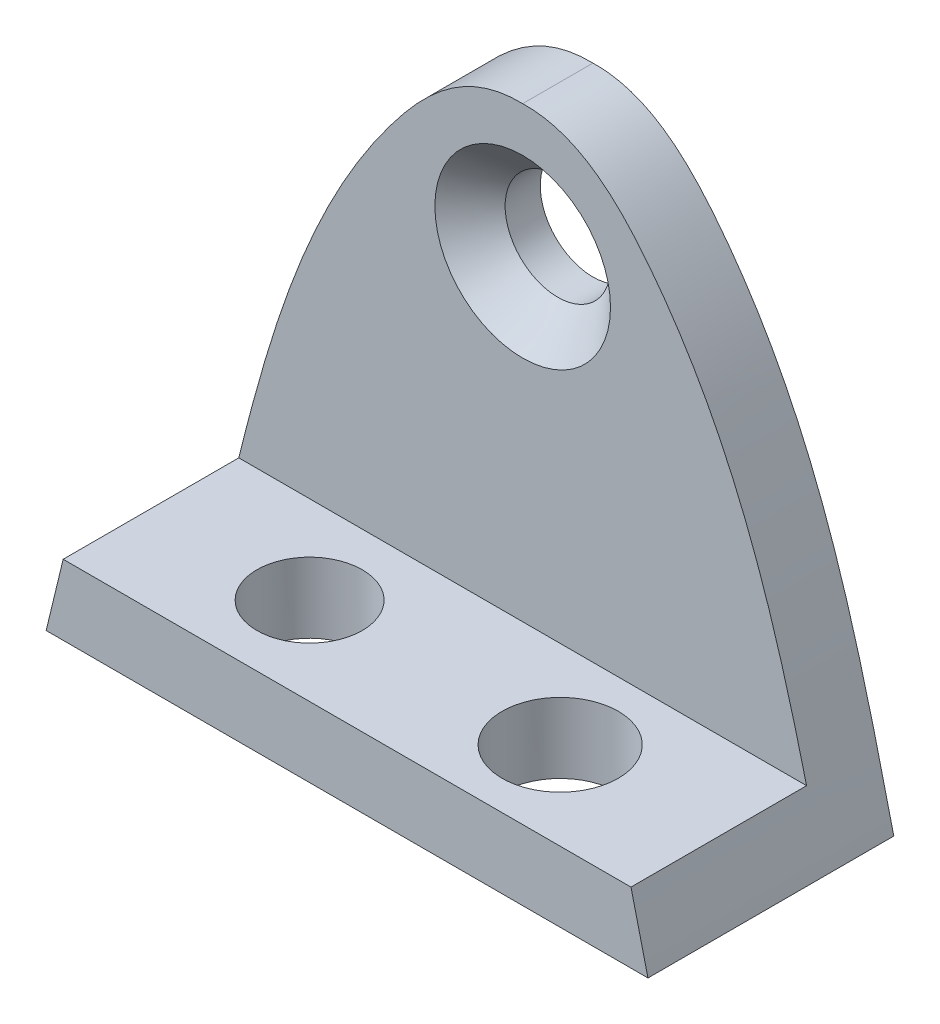
ISO-10303-21;
HEADER;
FILE_DESCRIPTION(('STEP AP214'),'2;1');
FILE_NAME('part.step','',(''),(''),'','','');
FILE_SCHEMA(('AUTOMOTIVE_DESIGN { 1 0 10303 214 1 1 1 1 }'));
ENDSEC;
DATA;
#1=APPLICATION_CONTEXT('core data for automotive mechanical design processes');
#2=APPLICATION_PROTOCOL_DEFINITION('international standard','automotive_design',2000,#1);
#3=PRODUCT_CONTEXT('',#1,'mechanical');
#4=PRODUCT('Part','Part','',(#3));
#5=PRODUCT_RELATED_PRODUCT_CATEGORY('part','',(#4));
#6=PRODUCT_DEFINITION_FORMATION('','',#4);
#7=PRODUCT_DEFINITION_CONTEXT('part definition',#1,'design');
#8=PRODUCT_DEFINITION('design','',#6,#7);
#9=PRODUCT_DEFINITION_SHAPE('','',#8);
#10=(LENGTH_UNIT() NAMED_UNIT(*) SI_UNIT(.MILLI.,.METRE.));
#11=(NAMED_UNIT(*) PLANE_ANGLE_UNIT() SI_UNIT($,.RADIAN.));
#12=(NAMED_UNIT(*) SI_UNIT($,.STERADIAN.) SOLID_ANGLE_UNIT());
#13=UNCERTAINTY_MEASURE_WITH_UNIT(LENGTH_MEASURE(1.E-05),#10,'distance_accuracy_value','');
#14=(GEOMETRIC_REPRESENTATION_CONTEXT(3) GLOBAL_UNCERTAINTY_ASSIGNED_CONTEXT((#13)) GLOBAL_UNIT_ASSIGNED_CONTEXT((#10,
#11,#12)) REPRESENTATION_CONTEXT('',''));
#15=CARTESIAN_POINT('',(0.,0.,0.));
#16=DIRECTION('',(0.,0.,1.));
#17=DIRECTION('',(1.,0.,0.));
#18=AXIS2_PLACEMENT_3D('',#15,#16,#17);
#19=CARTESIAN_POINT('',(5.9648004734803,-2.43145539351732,2.));
#20=DIRECTION('',(0.,0.,1.));
#21=DIRECTION('',(1.,0.,0.));
#22=AXIS2_PLACEMENT_3D('',#19,#20,#21);
#23=PLANE('',#22);
#24=DIRECTION('',(-1.,0.,0.));
#25=VECTOR('',#24,1.);
#26=CARTESIAN_POINT('',(-8.08286575431049,-9.00000000000001,2.));
#27=LINE('',#26,#25);
#28=CARTESIAN_POINT('',(8.08286575431049,-8.99999999999996,2.));
#29=VERTEX_POINT('',#28);
#30=CARTESIAN_POINT('',(-8.0828657543105,-9.,2.));
#31=VERTEX_POINT('',#30);
#32=EDGE_CURVE('E52',#29,#31,#27,.T.);
#33=ORIENTED_EDGE('',*,*,#32,.F.);
#34=CARTESIAN_POINT('',(8.56689407207941,-11.,2.));
#35=CARTESIAN_POINT('',(7.52958222051159,-6.66766416722178,2.));
#36=CARTESIAN_POINT('',(6.14281172978499,-0.719191195387025,2.));
#37=CARTESIAN_POINT('',(1.62139649963288,3.81543945104685,2.));
#38=CARTESIAN_POINT('',(0.,3.77456368143573,2.));
#39=B_SPLINE_CURVE_WITH_KNOTS('',3,(#34,#35,#36,#37,#38),.UNSPECIFIED.,.F.,.F.,(4,1,4),(0.,
0.748937006269742,1.),.UNSPECIFIED.);
#40=CARTESIAN_POINT('',(0.,3.77456368143573,2.));
#41=VERTEX_POINT('',#40);
#42=EDGE_CURVE('E56',#29,#41,#39,.T.);
#43=ORIENTED_EDGE('',*,*,#42,.T.);
#44=CARTESIAN_POINT('',(0.,3.77456368143573,2.));
#45=CARTESIAN_POINT('',(-1.62139649963288,3.81543945104685,2.));
#46=CARTESIAN_POINT('',(-6.14281172978499,-0.719191195387026,2.));
#47=CARTESIAN_POINT('',(-7.52958222051159,-6.66766416722178,2.));
#48=CARTESIAN_POINT('',(-8.56689407207941,-11.,2.));
#49=B_SPLINE_CURVE_WITH_KNOTS('',3,(#44,#45,#46,#47,#48),.UNSPECIFIED.,.F.,.F.,(4,1,4),(0.,
0.251062993730258,1.),.UNSPECIFIED.);
#50=EDGE_CURVE('E99',#41,#31,#49,.T.);
#51=ORIENTED_EDGE('',*,*,#50,.T.);
#52=EDGE_LOOP('',(#33,#43,#51));
#53=FACE_BOUND('',#52,.T.);
#54=CARTESIAN_POINT('',(0.,0.,2.));
#55=DIRECTION('',(0.,0.,1.));
#56=DIRECTION('',(1.,0.,0.));
#57=AXIS2_PLACEMENT_3D('',#54,#55,#56);
#58=CIRCLE('',#57,2.50000000000001);
#59=CARTESIAN_POINT('',(2.50000000000001,0.,2.));
#60=VERTEX_POINT('',#59);
#61=EDGE_CURVE('E11',#60,#60,#58,.F.);
#62=ORIENTED_EDGE('',*,*,#61,.T.);
#63=EDGE_LOOP('',(#62));
#64=FACE_BOUND('',#63,.T.);
#65=ADVANCED_FACE('F35',(#53,#64),#23,.T.);
#66=CARTESIAN_POINT('',(5.9648004734803,-2.43145539351732,0.));
#67=DIRECTION('',(0.,0.,1.));
#68=DIRECTION('',(1.,0.,0.));
#69=AXIS2_PLACEMENT_3D('',#66,#67,#68);
#70=PLANE('',#69);
#71=CARTESIAN_POINT('',(8.56689407207941,-11.,0.));
#72=CARTESIAN_POINT('',(7.52958222051159,-6.66766416722178,0.));
#73=CARTESIAN_POINT('',(6.14281172978499,-0.719191195387025,0.));
#74=CARTESIAN_POINT('',(1.62139649963288,3.81543945104685,0.));
#75=CARTESIAN_POINT('',(0.,3.77456368143573,0.));
#76=B_SPLINE_CURVE_WITH_KNOTS('',3,(#71,#72,#73,#74,#75),.UNSPECIFIED.,.F.,.F.,(4,1,4),(0.,
0.748937006269742,1.),.UNSPECIFIED.);
#77=CARTESIAN_POINT('',(8.56689407207941,-11.,0.));
#78=VERTEX_POINT('',#77);
#79=CARTESIAN_POINT('',(0.,3.77456368143573,0.));
#80=VERTEX_POINT('',#79);
#81=EDGE_CURVE('E85',#78,#80,#76,.T.);
#82=ORIENTED_EDGE('',*,*,#81,.F.);
#83=DIRECTION('',(1.,0.,0.));
#84=VECTOR('',#83,1.);
#85=CARTESIAN_POINT('',(8.56689407207941,-11.,0.));
#86=LINE('',#85,#84);
#87=CARTESIAN_POINT('',(-8.56689407207941,-11.,0.));
#88=VERTEX_POINT('',#87);
#89=EDGE_CURVE('E84',#88,#78,#86,.T.);
#90=ORIENTED_EDGE('',*,*,#89,.F.);
#91=CARTESIAN_POINT('',(0.,3.77456368143573,0.));
#92=CARTESIAN_POINT('',(-1.62139649963288,3.81543945104685,0.));
#93=CARTESIAN_POINT('',(-6.14281172978499,-0.719191195387026,0.));
#94=CARTESIAN_POINT('',(-7.52958222051159,-6.66766416722178,0.));
#95=CARTESIAN_POINT('',(-8.56689407207941,-11.,0.));
#96=B_SPLINE_CURVE_WITH_KNOTS('',3,(#91,#92,#93,#94,#95),.UNSPECIFIED.,.F.,.F.,(4,1,4),(0.,
0.251062993730258,1.),.UNSPECIFIED.);
#97=EDGE_CURVE('E72',#80,#88,#96,.T.);
#98=ORIENTED_EDGE('',*,*,#97,.F.);
#99=EDGE_LOOP('',(#82,#90,#98));
#100=FACE_BOUND('',#99,.T.);
#101=CARTESIAN_POINT('',(0.,0.,0.));
#102=DIRECTION('',(0.,0.,1.));
#103=DIRECTION('',(1.,0.,0.));
#104=AXIS2_PLACEMENT_3D('',#101,#102,#103);
#105=CIRCLE('',#104,1.5);
#106=CARTESIAN_POINT('',(1.5,0.,0.));
#107=VERTEX_POINT('',#106);
#108=EDGE_CURVE('E116',#107,#107,#105,.T.);
#109=ORIENTED_EDGE('',*,*,#108,.T.);
#110=EDGE_LOOP('',(#109));
#111=FACE_BOUND('',#110,.T.);
#112=ADVANCED_FACE('F96',(#100,#111),#70,.F.);
#113=DIRECTION('',(0.,0.,-1.));
#114=VECTOR('',#113,1.);
#115=SURFACE_OF_LINEAR_EXTRUSION('',#39,#114);
#116=ORIENTED_EDGE('',*,*,#81,.T.);
#117=DIRECTION('',(0.,0.,-1.));
#118=VECTOR('',#117,1.);
#119=CARTESIAN_POINT('',(0.,3.77456368143573,2.));
#120=LINE('',#119,#118);
#121=EDGE_CURVE('E79',#41,#80,#120,.T.);
#122=ORIENTED_EDGE('',*,*,#121,.F.);
#123=ORIENTED_EDGE('',*,*,#42,.F.);
#124=DIRECTION('',(0.,0.,-1.));
#125=VECTOR('',#124,1.);
#126=CARTESIAN_POINT('',(8.08286575431051,-9.00000000000001,4.5));
#127=LINE('',#126,#125);
#128=CARTESIAN_POINT('',(8.0828657543105,-9.00000000000001,7.));
#129=VERTEX_POINT('',#128);
#130=EDGE_CURVE('E191',#129,#29,#127,.T.);
#131=ORIENTED_EDGE('',*,*,#130,.F.);
#132=CARTESIAN_POINT('',(8.56689407207941,-11.,7.));
#133=CARTESIAN_POINT('',(8.52696505124378,-10.833234735802,7.));
#134=CARTESIAN_POINT('',(8.48707462942251,-10.6664601249357,7.));
#135=CARTESIAN_POINT('',(8.40716041461697,-10.3329436389963,7.));
#136=CARTESIAN_POINT('',(8.36713662219982,-10.1662017637871,7.));
#137=CARTESIAN_POINT('',(8.28674470940421,-9.83280054515064,7.));
#138=CARTESIAN_POINT('',(8.24637658857999,-9.66614120183047,7.));
#139=CARTESIAN_POINT('',(8.16508768352697,-9.33295672415036,7.));
#140=CARTESIAN_POINT('',(8.12416689695186,-9.16643159036338,7.));
#141=CARTESIAN_POINT('',(8.08286575431051,-9.00000000000001,7.));
#142=B_SPLINE_CURVE_WITH_KNOTS('',3,(#132,#133,#134,#135,#136,#137,#138,#139,#140,#141),
.UNSPECIFIED.,.F.,.F.,(4,2,2,2,4),(0.,0.514436588397683,1.02887099209593,1.5433060618982,
2.05774331639709),.UNSPECIFIED.);
#143=CARTESIAN_POINT('',(8.56689407207941,-11.,7.));
#144=VERTEX_POINT('',#143);
#145=EDGE_CURVE('E133',#144,#129,#142,.T.);
#146=ORIENTED_EDGE('',*,*,#145,.F.);
#147=DIRECTION('',(0.,0.,-1.));
#148=VECTOR('',#147,1.);
#149=CARTESIAN_POINT('',(8.56689407207941,-11.,2.));
#150=LINE('',#149,#148);
#151=EDGE_CURVE('E94',#144,#78,#150,.T.);
#152=ORIENTED_EDGE('',*,*,#151,.T.);
#153=EDGE_LOOP('',(#116,#122,#123,#131,#146,#152));
#154=FACE_BOUND('',#153,.T.);
#155=ADVANCED_FACE('F125',(#154),#115,.F.);
#156=DIRECTION('',(0.,0.,-1.));
#157=VECTOR('',#156,1.);
#158=SURFACE_OF_LINEAR_EXTRUSION('',#49,#157);
#159=ORIENTED_EDGE('',*,*,#97,.T.);
#160=DIRECTION('',(0.,0.,-1.));
#161=VECTOR('',#160,1.);
#162=CARTESIAN_POINT('',(-8.56689407207941,-11.,2.));
#163=LINE('',#162,#161);
#164=CARTESIAN_POINT('',(-8.56689407207941,-11.,7.));
#165=VERTEX_POINT('',#164);
#166=EDGE_CURVE('E76',#165,#88,#163,.T.);
#167=ORIENTED_EDGE('',*,*,#166,.F.);
#168=CARTESIAN_POINT('',(-8.0828657543105,-9.,7.));
#169=CARTESIAN_POINT('',(-8.12416689695185,-9.16643159036338,7.));
#170=CARTESIAN_POINT('',(-8.16508768352697,-9.33295672415036,7.));
#171=CARTESIAN_POINT('',(-8.24637658857999,-9.66614120183047,7.));
#172=CARTESIAN_POINT('',(-8.28674470940421,-9.83280054515064,7.));
#173=CARTESIAN_POINT('',(-8.36713662219981,-10.1662017637871,7.));
#174=CARTESIAN_POINT('',(-8.40716041461696,-10.3329436389963,7.));
#175=CARTESIAN_POINT('',(-8.48707462942251,-10.6664601249357,7.));
#176=CARTESIAN_POINT('',(-8.52696505124378,-10.833234735802,7.));
#177=CARTESIAN_POINT('',(-8.56689407207941,-11.,7.));
#178=B_SPLINE_CURVE_WITH_KNOTS('',3,(#168,#169,#170,#171,#172,#173,#174,#175,#176,#177),
.UNSPECIFIED.,.F.,.F.,(4,2,2,2,4),(0.,0.514437254498893,1.02887232430117,1.54330672799941,
2.0577433163971),.UNSPECIFIED.);
#179=CARTESIAN_POINT('',(-8.0828657543105,-9.,7.));
#180=VERTEX_POINT('',#179);
#181=EDGE_CURVE('E143',#180,#165,#178,.T.);
#182=ORIENTED_EDGE('',*,*,#181,.F.);
#183=DIRECTION('',(0.,0.,-1.));
#184=VECTOR('',#183,1.);
#185=CARTESIAN_POINT('',(-8.0828657543105,-9.,4.5));
#186=LINE('',#185,#184);
#187=EDGE_CURVE('E187',#180,#31,#186,.T.);
#188=ORIENTED_EDGE('',*,*,#187,.T.);
#189=ORIENTED_EDGE('',*,*,#50,.F.);
#190=ORIENTED_EDGE('',*,*,#121,.T.);
#191=EDGE_LOOP('',(#159,#167,#182,#188,#189,#190));
#192=FACE_BOUND('',#191,.T.);
#193=ADVANCED_FACE('F74',(#192),#158,.F.);
#194=CARTESIAN_POINT('',(8.56689407207941,-11.,2.));
#195=DIRECTION('',(0.,1.,0.));
#196=DIRECTION('',(-1.,0.,0.));
#197=AXIS2_PLACEMENT_3D('',#194,#195,#196);
#198=PLANE('',#197);
#199=CARTESIAN_POINT('',(3.56689407207942,-11.,4.5));
#200=DIRECTION('',(0.,-1.,0.));
#201=DIRECTION('',(1.,0.,0.));
#202=AXIS2_PLACEMENT_3D('',#199,#200,#201);
#203=CIRCLE('',#202,1.65403200407865);
#204=CARTESIAN_POINT('',(5.22092607615807,-11.,4.5));
#205=VERTEX_POINT('',#204);
#206=EDGE_CURVE('E175',#205,#205,#203,.T.);
#207=ORIENTED_EDGE('',*,*,#206,.F.);
#208=EDGE_LOOP('',(#207));
#209=FACE_BOUND('',#208,.T.);
#210=CARTESIAN_POINT('',(-3.56689407207941,-11.,4.5));
#211=DIRECTION('',(0.,-1.,0.));
#212=DIRECTION('',(1.,0.,0.));
#213=AXIS2_PLACEMENT_3D('',#210,#211,#212);
#214=CIRCLE('',#213,1.5);
#215=CARTESIAN_POINT('',(-2.06689407207941,-11.,4.5));
#216=VERTEX_POINT('',#215);
#217=EDGE_CURVE('E178',#216,#216,#214,.T.);
#218=ORIENTED_EDGE('',*,*,#217,.F.);
#219=EDGE_LOOP('',(#218));
#220=FACE_BOUND('',#219,.T.);
#221=ORIENTED_EDGE('',*,*,#89,.T.);
#222=ORIENTED_EDGE('',*,*,#151,.F.);
#223=DIRECTION('',(1.,0.,0.));
#224=VECTOR('',#223,1.);
#225=CARTESIAN_POINT('',(-8.56689407207941,-11.,7.));
#226=LINE('',#225,#224);
#227=EDGE_CURVE('E92',#165,#144,#226,.T.);
#228=ORIENTED_EDGE('',*,*,#227,.F.);
#229=ORIENTED_EDGE('',*,*,#166,.T.);
#230=EDGE_LOOP('',(#221,#222,#228,#229));
#231=FACE_BOUND('',#230,.T.);
#232=ADVANCED_FACE('F88',(#209,#220,#231),#198,.F.);
#233=CARTESIAN_POINT('',(0.,0.,2.));
#234=DIRECTION('',(0.,0.,-1.));
#235=DIRECTION('',(-1.,0.,0.));
#236=AXIS2_PLACEMENT_3D('',#233,#234,#235);
#237=CYLINDRICAL_SURFACE('',#236,1.5);
#238=CARTESIAN_POINT('',(0.,0.,0.999999999999993));
#239=DIRECTION('',(0.,0.,1.));
#240=DIRECTION('',(1.,0.,0.));
#241=AXIS2_PLACEMENT_3D('',#238,#239,#240);
#242=CIRCLE('',#241,1.5);
#243=CARTESIAN_POINT('',(1.5,0.,0.999999999999993));
#244=VERTEX_POINT('',#243);
#245=EDGE_CURVE('E44',#244,#244,#242,.T.);
#246=ORIENTED_EDGE('',*,*,#245,.T.);
#247=EDGE_LOOP('',(#246));
#248=FACE_BOUND('',#247,.T.);
#249=ORIENTED_EDGE('',*,*,#108,.F.);
#250=EDGE_LOOP('',(#249));
#251=FACE_BOUND('',#250,.T.);
#252=ADVANCED_FACE('F160',(#248,#251),#237,.F.);
#253=CARTESIAN_POINT('',(0.,0.,0.999999999999993));
#254=DIRECTION('',(0.,0.,1.));
#255=DIRECTION('',(1.,0.,0.));
#256=AXIS2_PLACEMENT_3D('',#253,#254,#255);
#257=CONICAL_SURFACE('',#256,1.5,0.785398163397449);
#258=ORIENTED_EDGE('',*,*,#61,.F.);
#259=EDGE_LOOP('',(#258));
#260=FACE_BOUND('',#259,.T.);
#261=ORIENTED_EDGE('',*,*,#245,.F.);
#262=EDGE_LOOP('',(#261));
#263=FACE_BOUND('',#262,.T.);
#264=ADVANCED_FACE('F37',(#260,#263),#257,.F.);
#265=CARTESIAN_POINT('',(-8.08286575431049,-9.00000000000001,7.));
#266=DIRECTION('',(0.,-1.,0.));
#267=DIRECTION('',(0.,0.,-1.));
#268=AXIS2_PLACEMENT_3D('',#265,#266,#267);
#269=PLANE('',#268);
#270=CARTESIAN_POINT('',(3.56689407207942,-9.00000000000001,4.5));
#271=DIRECTION('',(0.,-1.,0.));
#272=DIRECTION('',(0.,0.,-1.));
#273=AXIS2_PLACEMENT_3D('',#270,#271,#272);
#274=CIRCLE('',#273,1.65403200407865);
#275=CARTESIAN_POINT('',(3.56689407207942,-9.00000000000001,2.84596799592135));
#276=VERTEX_POINT('',#275);
#277=EDGE_CURVE('E39',#276,#276,#274,.T.);
#278=ORIENTED_EDGE('',*,*,#277,.T.);
#279=EDGE_LOOP('',(#278));
#280=FACE_BOUND('',#279,.T.);
#281=CARTESIAN_POINT('',(-3.56689407207941,-9.00000000000001,4.5));
#282=DIRECTION('',(0.,-1.,0.));
#283=DIRECTION('',(0.,0.,-1.));
#284=AXIS2_PLACEMENT_3D('',#281,#282,#283);
#285=CIRCLE('',#284,1.5);
#286=CARTESIAN_POINT('',(-3.56689407207941,-9.00000000000001,3.));
#287=VERTEX_POINT('',#286);
#288=EDGE_CURVE('E180',#287,#287,#285,.T.);
#289=ORIENTED_EDGE('',*,*,#288,.T.);
#290=EDGE_LOOP('',(#289));
#291=FACE_BOUND('',#290,.T.);
#292=ORIENTED_EDGE('',*,*,#32,.T.);
#293=ORIENTED_EDGE('',*,*,#187,.F.);
#294=DIRECTION('',(-1.,0.,0.));
#295=VECTOR('',#294,1.);
#296=CARTESIAN_POINT('',(-8.08286575431049,-9.00000000000001,7.));
#297=LINE('',#296,#295);
#298=EDGE_CURVE('E140',#129,#180,#297,.T.);
#299=ORIENTED_EDGE('',*,*,#298,.F.);
#300=ORIENTED_EDGE('',*,*,#130,.T.);
#301=EDGE_LOOP('',(#292,#293,#299,#300));
#302=FACE_BOUND('',#301,.T.);
#303=ADVANCED_FACE('F153',(#280,#291,#302),#269,.F.);
#304=CARTESIAN_POINT('',(-5.9648004734803,-2.43145539351732,7.));
#305=DIRECTION('',(0.,0.,-1.));
#306=DIRECTION('',(-1.,0.,0.));
#307=AXIS2_PLACEMENT_3D('',#304,#305,#306);
#308=PLANE('',#307);
#309=ORIENTED_EDGE('',*,*,#181,.T.);
#310=ORIENTED_EDGE('',*,*,#227,.T.);
#311=ORIENTED_EDGE('',*,*,#145,.T.);
#312=ORIENTED_EDGE('',*,*,#298,.T.);
#313=EDGE_LOOP('',(#309,#310,#311,#312));
#314=FACE_BOUND('',#313,.T.);
#315=ADVANCED_FACE('F147',(#314),#308,.F.);
#316=CARTESIAN_POINT('',(-3.56689407207942,3.81546445104686,4.5));
#317=DIRECTION('',(0.,-1.,0.));
#318=DIRECTION('',(1.,0.,0.));
#319=AXIS2_PLACEMENT_3D('',#316,#317,#318);
#320=CYLINDRICAL_SURFACE('',#319,1.5);
#321=ORIENTED_EDGE('',*,*,#217,.T.);
#322=EDGE_LOOP('',(#321));
#323=FACE_BOUND('',#322,.T.);
#324=ORIENTED_EDGE('',*,*,#288,.F.);
#325=EDGE_LOOP('',(#324));
#326=FACE_BOUND('',#325,.T.);
#327=ADVANCED_FACE('F152',(#323,#326),#320,.F.);
#328=CARTESIAN_POINT('',(3.56689407207941,3.81546445104686,4.5));
#329=DIRECTION('',(0.,-1.,0.));
#330=DIRECTION('',(1.,0.,0.));
#331=AXIS2_PLACEMENT_3D('',#328,#329,#330);
#332=CYLINDRICAL_SURFACE('',#331,1.65403200407865);
#333=ORIENTED_EDGE('',*,*,#206,.T.);
#334=EDGE_LOOP('',(#333));
#335=FACE_BOUND('',#334,.T.);
#336=ORIENTED_EDGE('',*,*,#277,.F.);
#337=EDGE_LOOP('',(#336));
#338=FACE_BOUND('',#337,.T.);
#339=ADVANCED_FACE('F242',(#335,#338),#332,.F.);
#340=CLOSED_SHELL('',(#65,#112,#155,#193,#232,#252,#264,#303,#315,#327,#339));
#341=MANIFOLD_SOLID_BREP('B2',#340);
#342=ADVANCED_BREP_SHAPE_REPRESENTATION('',(#18,#341),#14);
#343=SHAPE_DEFINITION_REPRESENTATION(#9,#342);
ENDSEC;
END-ISO-10303-21;
